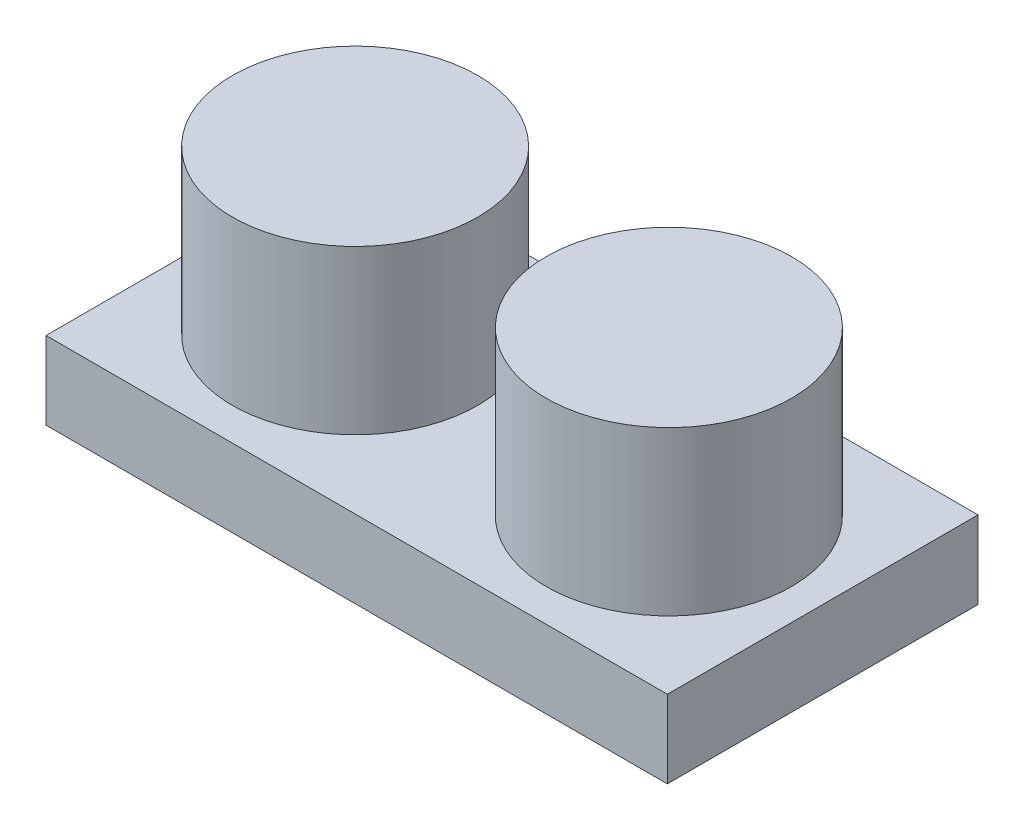
ISO-10303-21;
HEADER;
FILE_DESCRIPTION(('STEP AP214'),'2;1');
FILE_NAME('part.step','',(''),(''),'','','');
FILE_SCHEMA(('AUTOMOTIVE_DESIGN { 1 0 10303 214 1 1 1 1 }'));
ENDSEC;
DATA;
#1=APPLICATION_CONTEXT('core data for automotive mechanical design processes');
#2=APPLICATION_PROTOCOL_DEFINITION('international standard','automotive_design',2000,#1);
#3=PRODUCT_CONTEXT('',#1,'mechanical');
#4=PRODUCT('Part','Part','',(#3));
#5=PRODUCT_RELATED_PRODUCT_CATEGORY('part','',(#4));
#6=PRODUCT_DEFINITION_FORMATION('','',#4);
#7=PRODUCT_DEFINITION_CONTEXT('part definition',#1,'design');
#8=PRODUCT_DEFINITION('design','',#6,#7);
#9=PRODUCT_DEFINITION_SHAPE('','',#8);
#10=(LENGTH_UNIT() NAMED_UNIT(*) SI_UNIT(.MILLI.,.METRE.));
#11=(NAMED_UNIT(*) PLANE_ANGLE_UNIT() SI_UNIT($,.RADIAN.));
#12=(NAMED_UNIT(*) SI_UNIT($,.STERADIAN.) SOLID_ANGLE_UNIT());
#13=UNCERTAINTY_MEASURE_WITH_UNIT(LENGTH_MEASURE(1.E-05),#10,'distance_accuracy_value','');
#14=(GEOMETRIC_REPRESENTATION_CONTEXT(3) GLOBAL_UNCERTAINTY_ASSIGNED_CONTEXT((#13)) GLOBAL_UNIT_ASSIGNED_CONTEXT((#10,
#11,#12)) REPRESENTATION_CONTEXT('',''));
#15=CARTESIAN_POINT('',(0.,0.,0.));
#16=DIRECTION('',(0.,0.,1.));
#17=DIRECTION('',(1.,0.,0.));
#18=AXIS2_PLACEMENT_3D('',#15,#16,#17);
#19=CARTESIAN_POINT('',(20.,5.,-10.));
#20=DIRECTION('',(-1.,0.,0.));
#21=DIRECTION('',(0.,0.,1.));
#22=AXIS2_PLACEMENT_3D('',#19,#20,#21);
#23=PLANE('',#22);
#24=DIRECTION('',(0.,0.,-1.));
#25=VECTOR('',#24,1.);
#26=CARTESIAN_POINT('',(20.,0.,-10.));
#27=LINE('',#26,#25);
#28=CARTESIAN_POINT('',(20.,0.,10.));
#29=VERTEX_POINT('',#28);
#30=CARTESIAN_POINT('',(20.,0.,-10.));
#31=VERTEX_POINT('',#30);
#32=EDGE_CURVE('E111',#29,#31,#27,.T.);
#33=ORIENTED_EDGE('',*,*,#32,.T.);
#34=DIRECTION('',(0.,-1.,0.));
#35=VECTOR('',#34,1.);
#36=CARTESIAN_POINT('',(20.,5.,-10.));
#37=LINE('',#36,#35);
#38=CARTESIAN_POINT('',(20.,5.,-10.));
#39=VERTEX_POINT('',#38);
#40=EDGE_CURVE('E11',#39,#31,#37,.T.);
#41=ORIENTED_EDGE('',*,*,#40,.F.);
#42=DIRECTION('',(0.,0.,-1.));
#43=VECTOR('',#42,1.);
#44=CARTESIAN_POINT('',(20.,5.,-10.));
#45=LINE('',#44,#43);
#46=CARTESIAN_POINT('',(20.,5.,10.));
#47=VERTEX_POINT('',#46);
#48=EDGE_CURVE('E95',#47,#39,#45,.T.);
#49=ORIENTED_EDGE('',*,*,#48,.F.);
#50=DIRECTION('',(0.,-1.,0.));
#51=VECTOR('',#50,1.);
#52=CARTESIAN_POINT('',(20.,5.,10.));
#53=LINE('',#52,#51);
#54=EDGE_CURVE('E107',#47,#29,#53,.T.);
#55=ORIENTED_EDGE('',*,*,#54,.T.);
#56=EDGE_LOOP('',(#33,#41,#49,#55));
#57=FACE_BOUND('',#56,.T.);
#58=ADVANCED_FACE('F43',(#57),#23,.F.);
#59=CARTESIAN_POINT('',(-20.,5.,-10.));
#60=DIRECTION('',(0.,0.,1.));
#61=DIRECTION('',(1.,0.,0.));
#62=AXIS2_PLACEMENT_3D('',#59,#60,#61);
#63=PLANE('',#62);
#64=DIRECTION('',(-1.,0.,0.));
#65=VECTOR('',#64,1.);
#66=CARTESIAN_POINT('',(-20.,0.,-10.));
#67=LINE('',#66,#65);
#68=CARTESIAN_POINT('',(-20.,0.,-10.));
#69=VERTEX_POINT('',#68);
#70=EDGE_CURVE('E100',#31,#69,#67,.T.);
#71=ORIENTED_EDGE('',*,*,#70,.T.);
#72=DIRECTION('',(0.,-1.,0.));
#73=VECTOR('',#72,1.);
#74=CARTESIAN_POINT('',(-20.,5.,-10.));
#75=LINE('',#74,#73);
#76=CARTESIAN_POINT('',(-20.,5.,-10.));
#77=VERTEX_POINT('',#76);
#78=EDGE_CURVE('E52',#77,#69,#75,.T.);
#79=ORIENTED_EDGE('',*,*,#78,.F.);
#80=DIRECTION('',(-1.,0.,0.));
#81=VECTOR('',#80,1.);
#82=CARTESIAN_POINT('',(-20.,5.,-10.));
#83=LINE('',#82,#81);
#84=EDGE_CURVE('E90',#39,#77,#83,.T.);
#85=ORIENTED_EDGE('',*,*,#84,.F.);
#86=ORIENTED_EDGE('',*,*,#40,.T.);
#87=EDGE_LOOP('',(#71,#79,#85,#86));
#88=FACE_BOUND('',#87,.T.);
#89=ADVANCED_FACE('F99',(#88),#63,.F.);
#90=CARTESIAN_POINT('',(-20.,5.,-10.));
#91=DIRECTION('',(1.,0.,0.));
#92=DIRECTION('',(0.,0.,-1.));
#93=AXIS2_PLACEMENT_3D('',#90,#91,#92);
#94=PLANE('',#93);
#95=DIRECTION('',(0.,0.,1.));
#96=VECTOR('',#95,1.);
#97=CARTESIAN_POINT('',(-20.,0.,-10.));
#98=LINE('',#97,#96);
#99=CARTESIAN_POINT('',(-20.,0.,10.));
#100=VERTEX_POINT('',#99);
#101=EDGE_CURVE('E77',#69,#100,#98,.T.);
#102=ORIENTED_EDGE('',*,*,#101,.T.);
#103=DIRECTION('',(0.,-1.,0.));
#104=VECTOR('',#103,1.);
#105=CARTESIAN_POINT('',(-20.,5.,10.));
#106=LINE('',#105,#104);
#107=CARTESIAN_POINT('',(-20.,5.,10.));
#108=VERTEX_POINT('',#107);
#109=EDGE_CURVE('E102',#108,#100,#106,.T.);
#110=ORIENTED_EDGE('',*,*,#109,.F.);
#111=DIRECTION('',(0.,0.,1.));
#112=VECTOR('',#111,1.);
#113=CARTESIAN_POINT('',(-20.,5.,-10.));
#114=LINE('',#113,#112);
#115=EDGE_CURVE('E93',#77,#108,#114,.T.);
#116=ORIENTED_EDGE('',*,*,#115,.F.);
#117=ORIENTED_EDGE('',*,*,#78,.T.);
#118=EDGE_LOOP('',(#102,#110,#116,#117));
#119=FACE_BOUND('',#118,.T.);
#120=ADVANCED_FACE('F103',(#119),#94,.F.);
#121=CARTESIAN_POINT('',(-20.,5.,10.));
#122=DIRECTION('',(0.,0.,-1.));
#123=DIRECTION('',(-1.,0.,0.));
#124=AXIS2_PLACEMENT_3D('',#121,#122,#123);
#125=PLANE('',#124);
#126=DIRECTION('',(1.,0.,0.));
#127=VECTOR('',#126,1.);
#128=CARTESIAN_POINT('',(-20.,0.,10.));
#129=LINE('',#128,#127);
#130=EDGE_CURVE('E83',#100,#29,#129,.T.);
#131=ORIENTED_EDGE('',*,*,#130,.T.);
#132=ORIENTED_EDGE('',*,*,#54,.F.);
#133=DIRECTION('',(1.,0.,0.));
#134=VECTOR('',#133,1.);
#135=CARTESIAN_POINT('',(-20.,5.,10.));
#136=LINE('',#135,#134);
#137=EDGE_CURVE('E60',#108,#47,#136,.T.);
#138=ORIENTED_EDGE('',*,*,#137,.F.);
#139=ORIENTED_EDGE('',*,*,#109,.T.);
#140=EDGE_LOOP('',(#131,#132,#138,#139));
#141=FACE_BOUND('',#140,.T.);
#142=ADVANCED_FACE('F125',(#141),#125,.F.);
#143=CARTESIAN_POINT('',(0.,5.,0.));
#144=DIRECTION('',(0.,1.,0.));
#145=DIRECTION('',(0.,0.,1.));
#146=AXIS2_PLACEMENT_3D('',#143,#144,#145);
#147=PLANE('',#146);
#148=CARTESIAN_POINT('',(10.1,5.,0.));
#149=DIRECTION('',(0.,1.,0.));
#150=DIRECTION('',(0.,0.,1.));
#151=AXIS2_PLACEMENT_3D('',#148,#149,#150);
#152=CIRCLE('',#151,7.9);
#153=CARTESIAN_POINT('',(10.1,5.,-7.9));
#154=VERTEX_POINT('',#153);
#155=EDGE_CURVE('E136',#154,#154,#152,.T.);
#156=ORIENTED_EDGE('',*,*,#155,.F.);
#157=EDGE_LOOP('',(#156));
#158=FACE_BOUND('',#157,.T.);
#159=CARTESIAN_POINT('',(-10.1,5.,0.));
#160=DIRECTION('',(0.,1.,0.));
#161=DIRECTION('',(0.,0.,1.));
#162=AXIS2_PLACEMENT_3D('',#159,#160,#161);
#163=CIRCLE('',#162,7.9);
#164=CARTESIAN_POINT('',(-10.1,5.,-7.9));
#165=VERTEX_POINT('',#164);
#166=EDGE_CURVE('E132',#165,#165,#163,.T.);
#167=ORIENTED_EDGE('',*,*,#166,.F.);
#168=EDGE_LOOP('',(#167));
#169=FACE_BOUND('',#168,.T.);
#170=ORIENTED_EDGE('',*,*,#48,.T.);
#171=ORIENTED_EDGE('',*,*,#84,.T.);
#172=ORIENTED_EDGE('',*,*,#115,.T.);
#173=ORIENTED_EDGE('',*,*,#137,.T.);
#174=EDGE_LOOP('',(#170,#171,#172,#173));
#175=FACE_BOUND('',#174,.T.);
#176=ADVANCED_FACE('F91',(#158,#169,#175),#147,.T.);
#177=CARTESIAN_POINT('',(0.,0.,0.));
#178=DIRECTION('',(0.,1.,0.));
#179=DIRECTION('',(0.,0.,1.));
#180=AXIS2_PLACEMENT_3D('',#177,#178,#179);
#181=PLANE('',#180);
#182=ORIENTED_EDGE('',*,*,#32,.F.);
#183=ORIENTED_EDGE('',*,*,#130,.F.);
#184=ORIENTED_EDGE('',*,*,#101,.F.);
#185=ORIENTED_EDGE('',*,*,#70,.F.);
#186=EDGE_LOOP('',(#182,#183,#184,#185));
#187=FACE_BOUND('',#186,.T.);
#188=ADVANCED_FACE('F128',(#187),#181,.F.);
#189=CARTESIAN_POINT('',(-10.1,15.5,0.));
#190=DIRECTION('',(0.,-1.,0.));
#191=DIRECTION('',(0.,0.,-1.));
#192=AXIS2_PLACEMENT_3D('',#189,#190,#191);
#193=CYLINDRICAL_SURFACE('',#192,7.9);
#194=CARTESIAN_POINT('',(-10.1,15.5,0.));
#195=DIRECTION('',(0.,1.,0.));
#196=DIRECTION('',(0.,0.,1.));
#197=AXIS2_PLACEMENT_3D('',#194,#195,#196);
#198=CIRCLE('',#197,7.9);
#199=CARTESIAN_POINT('',(-10.1,15.5,-7.9));
#200=VERTEX_POINT('',#199);
#201=EDGE_CURVE('E115',#200,#200,#198,.T.);
#202=CARTESIAN_POINT('',(-10.1,15.5,-7.9));
#203=CARTESIAN_POINT('',(-10.1,15.390625,-7.9));
#204=CARTESIAN_POINT('',(-10.1,15.28125,-7.9));
#205=CARTESIAN_POINT('',(-10.1,15.0625,-7.9));
#206=CARTESIAN_POINT('',(-10.1,14.953125,-7.9));
#207=CARTESIAN_POINT('',(-10.1,14.734375,-7.9));
#208=CARTESIAN_POINT('',(-10.1,14.625,-7.9));
#209=CARTESIAN_POINT('',(-10.1,14.40625,-7.9));
#210=CARTESIAN_POINT('',(-10.1,14.296875,-7.9));
#211=CARTESIAN_POINT('',(-10.1,14.078125,-7.9));
#212=CARTESIAN_POINT('',(-10.1,13.96875,-7.9));
#213=CARTESIAN_POINT('',(-10.1,13.75,-7.9));
#214=CARTESIAN_POINT('',(-10.1,13.640625,-7.9));
#215=CARTESIAN_POINT('',(-10.1,13.421875,-7.9));
#216=CARTESIAN_POINT('',(-10.1,13.3125,-7.9));
#217=CARTESIAN_POINT('',(-10.1,13.09375,-7.9));
#218=CARTESIAN_POINT('',(-10.1,12.984375,-7.9));
#219=CARTESIAN_POINT('',(-10.1,12.765625,-7.9));
#220=CARTESIAN_POINT('',(-10.1,12.65625,-7.9));
#221=CARTESIAN_POINT('',(-10.1,12.4375,-7.9));
#222=CARTESIAN_POINT('',(-10.1,12.328125,-7.9));
#223=CARTESIAN_POINT('',(-10.1,12.109375,-7.9));
#224=CARTESIAN_POINT('',(-10.1,12.,-7.9));
#225=CARTESIAN_POINT('',(-10.1,11.78125,-7.9));
#226=CARTESIAN_POINT('',(-10.1,11.671875,-7.9));
#227=CARTESIAN_POINT('',(-10.1,11.453125,-7.9));
#228=CARTESIAN_POINT('',(-10.1,11.34375,-7.9));
#229=CARTESIAN_POINT('',(-10.1,11.125,-7.9));
#230=CARTESIAN_POINT('',(-10.1,11.015625,-7.9));
#231=CARTESIAN_POINT('',(-10.1,10.796875,-7.9));
#232=CARTESIAN_POINT('',(-10.1,10.6875,-7.9));
#233=CARTESIAN_POINT('',(-10.1,10.46875,-7.9));
#234=CARTESIAN_POINT('',(-10.1,10.359375,-7.9));
#235=CARTESIAN_POINT('',(-10.1,10.140625,-7.9));
#236=CARTESIAN_POINT('',(-10.1,10.03125,-7.9));
#237=CARTESIAN_POINT('',(-10.1,9.8125,-7.9));
#238=CARTESIAN_POINT('',(-10.1,9.703125,-7.9));
#239=CARTESIAN_POINT('',(-10.1,9.484375,-7.9));
#240=CARTESIAN_POINT('',(-10.1,9.375,-7.9));
#241=CARTESIAN_POINT('',(-10.1,9.15625,-7.9));
#242=CARTESIAN_POINT('',(-10.1,9.046875,-7.9));
#243=CARTESIAN_POINT('',(-10.1,8.828125,-7.9));
#244=CARTESIAN_POINT('',(-10.1,8.71875,-7.9));
#245=CARTESIAN_POINT('',(-10.1,8.5,-7.9));
#246=CARTESIAN_POINT('',(-10.1,8.390625,-7.9));
#247=CARTESIAN_POINT('',(-10.1,8.171875,-7.9));
#248=CARTESIAN_POINT('',(-10.1,8.0625,-7.9));
#249=CARTESIAN_POINT('',(-10.1,7.84375,-7.9));
#250=CARTESIAN_POINT('',(-10.1,7.734375,-7.9));
#251=CARTESIAN_POINT('',(-10.1,7.515625,-7.9));
#252=CARTESIAN_POINT('',(-10.1,7.40625,-7.9));
#253=CARTESIAN_POINT('',(-10.1,7.1875,-7.9));
#254=CARTESIAN_POINT('',(-10.1,7.078125,-7.9));
#255=CARTESIAN_POINT('',(-10.1,6.859375,-7.9));
#256=CARTESIAN_POINT('',(-10.1,6.75,-7.9));
#257=CARTESIAN_POINT('',(-10.1,6.53125,-7.9));
#258=CARTESIAN_POINT('',(-10.1,6.421875,-7.9));
#259=CARTESIAN_POINT('',(-10.1,6.203125,-7.9));
#260=CARTESIAN_POINT('',(-10.1,6.09375,-7.9));
#261=CARTESIAN_POINT('',(-10.1,5.875,-7.9));
#262=CARTESIAN_POINT('',(-10.1,5.765625,-7.9));
#263=CARTESIAN_POINT('',(-10.1,5.546875,-7.9));
#264=CARTESIAN_POINT('',(-10.1,5.4375,-7.9));
#265=CARTESIAN_POINT('',(-10.1,5.21875,-7.9));
#266=CARTESIAN_POINT('',(-10.1,5.109375,-7.9));
#267=CARTESIAN_POINT('',(-10.1,5.,-7.9));
#268=B_SPLINE_CURVE_WITH_KNOTS('',3,(#202,#203,#204,#205,#206,#207,#208,#209,#210,#211,#212,
#213,#214,#215,#216,#217,#218,#219,#220,#221,#222,#223,#224,#225,#226,#227,#228,#229,#230,#231,
#232,#233,#234,#235,#236,#237,#238,#239,#240,#241,#242,#243,#244,#245,#246,#247,#248,#249,#250,
#251,#252,#253,#254,#255,#256,#257,#258,#259,#260,#261,#262,#263,#264,#265,#266,#267),
.UNSPECIFIED.,.F.,.F.,(4,2,2,2,2,2,2,2,2,2,2,2,2,2,2,2,2,2,2,2,2,2,2,2,2,2,2,2,2,2,2,2,4),(0.,
0.328125,0.656250000000001,0.984375000000001,1.3125,1.640625,1.96875,2.296875,2.625,2.953125,
3.28125,3.609375,3.9375,4.265625,4.59375,4.921875,5.25,5.578125,5.90625,6.234375,6.5625,
6.890625,7.21875,7.546875,7.875,8.203125,8.53125,8.859375,9.1875,9.515625,9.84375,10.171875,
10.5),.UNSPECIFIED.);
#269=EDGE_CURVE('BSEAM155',#200,#165,#268,.T.);
#270=ORIENTED_EDGE('',*,*,#201,.F.);
#271=ORIENTED_EDGE('',*,*,#166,.T.);
#272=ORIENTED_EDGE('',*,*,#269,.T.);
#273=ORIENTED_EDGE('',*,*,#269,.F.);
#274=EDGE_LOOP('',(#270,#272,#271,#273));
#275=FACE_BOUND('',#274,.T.);
#276=ADVANCED_FACE('F155',(#275),#193,.T.);
#277=CARTESIAN_POINT('',(-10.1,15.5,0.));
#278=DIRECTION('',(0.,1.,0.));
#279=DIRECTION('',(0.,0.,1.));
#280=AXIS2_PLACEMENT_3D('',#277,#278,#279);
#281=PLANE('',#280);
#282=ORIENTED_EDGE('',*,*,#201,.T.);
#283=EDGE_LOOP('',(#282));
#284=FACE_BOUND('',#283,.T.);
#285=ADVANCED_FACE('F157',(#284),#281,.T.);
#286=CARTESIAN_POINT('',(10.1,15.5,0.));
#287=DIRECTION('',(0.,-1.,0.));
#288=DIRECTION('',(0.,0.,-1.));
#289=AXIS2_PLACEMENT_3D('',#286,#287,#288);
#290=CYLINDRICAL_SURFACE('',#289,7.9);
#291=CARTESIAN_POINT('',(10.1,15.5,0.));
#292=DIRECTION('',(0.,1.,0.));
#293=DIRECTION('',(0.,0.,1.));
#294=AXIS2_PLACEMENT_3D('',#291,#292,#293);
#295=CIRCLE('',#294,7.9);
#296=CARTESIAN_POINT('',(10.1,15.5,-7.9));
#297=VERTEX_POINT('',#296);
#298=EDGE_CURVE('E140',#297,#297,#295,.T.);
#299=CARTESIAN_POINT('',(10.1,15.5,-7.9));
#300=CARTESIAN_POINT('',(10.1,15.390625,-7.9));
#301=CARTESIAN_POINT('',(10.1,15.28125,-7.9));
#302=CARTESIAN_POINT('',(10.1,15.0625,-7.9));
#303=CARTESIAN_POINT('',(10.1,14.953125,-7.9));
#304=CARTESIAN_POINT('',(10.1,14.734375,-7.9));
#305=CARTESIAN_POINT('',(10.1,14.625,-7.9));
#306=CARTESIAN_POINT('',(10.1,14.40625,-7.9));
#307=CARTESIAN_POINT('',(10.1,14.296875,-7.9));
#308=CARTESIAN_POINT('',(10.1,14.078125,-7.9));
#309=CARTESIAN_POINT('',(10.1,13.96875,-7.9));
#310=CARTESIAN_POINT('',(10.1,13.75,-7.9));
#311=CARTESIAN_POINT('',(10.1,13.640625,-7.9));
#312=CARTESIAN_POINT('',(10.1,13.421875,-7.9));
#313=CARTESIAN_POINT('',(10.1,13.3125,-7.9));
#314=CARTESIAN_POINT('',(10.1,13.09375,-7.9));
#315=CARTESIAN_POINT('',(10.1,12.984375,-7.9));
#316=CARTESIAN_POINT('',(10.1,12.765625,-7.9));
#317=CARTESIAN_POINT('',(10.1,12.65625,-7.9));
#318=CARTESIAN_POINT('',(10.1,12.4375,-7.9));
#319=CARTESIAN_POINT('',(10.1,12.328125,-7.9));
#320=CARTESIAN_POINT('',(10.1,12.109375,-7.9));
#321=CARTESIAN_POINT('',(10.1,12.,-7.9));
#322=CARTESIAN_POINT('',(10.1,11.78125,-7.9));
#323=CARTESIAN_POINT('',(10.1,11.671875,-7.9));
#324=CARTESIAN_POINT('',(10.1,11.453125,-7.9));
#325=CARTESIAN_POINT('',(10.1,11.34375,-7.9));
#326=CARTESIAN_POINT('',(10.1,11.125,-7.9));
#327=CARTESIAN_POINT('',(10.1,11.015625,-7.9));
#328=CARTESIAN_POINT('',(10.1,10.796875,-7.9));
#329=CARTESIAN_POINT('',(10.1,10.6875,-7.9));
#330=CARTESIAN_POINT('',(10.1,10.46875,-7.9));
#331=CARTESIAN_POINT('',(10.1,10.359375,-7.9));
#332=CARTESIAN_POINT('',(10.1,10.140625,-7.9));
#333=CARTESIAN_POINT('',(10.1,10.03125,-7.9));
#334=CARTESIAN_POINT('',(10.1,9.8125,-7.9));
#335=CARTESIAN_POINT('',(10.1,9.703125,-7.9));
#336=CARTESIAN_POINT('',(10.1,9.484375,-7.9));
#337=CARTESIAN_POINT('',(10.1,9.375,-7.9));
#338=CARTESIAN_POINT('',(10.1,9.15625,-7.9));
#339=CARTESIAN_POINT('',(10.1,9.046875,-7.9));
#340=CARTESIAN_POINT('',(10.1,8.828125,-7.9));
#341=CARTESIAN_POINT('',(10.1,8.71875,-7.9));
#342=CARTESIAN_POINT('',(10.1,8.5,-7.9));
#343=CARTESIAN_POINT('',(10.1,8.390625,-7.9));
#344=CARTESIAN_POINT('',(10.1,8.171875,-7.9));
#345=CARTESIAN_POINT('',(10.1,8.0625,-7.9));
#346=CARTESIAN_POINT('',(10.1,7.84375,-7.9));
#347=CARTESIAN_POINT('',(10.1,7.734375,-7.9));
#348=CARTESIAN_POINT('',(10.1,7.515625,-7.9));
#349=CARTESIAN_POINT('',(10.1,7.40625,-7.9));
#350=CARTESIAN_POINT('',(10.1,7.1875,-7.9));
#351=CARTESIAN_POINT('',(10.1,7.078125,-7.9));
#352=CARTESIAN_POINT('',(10.1,6.859375,-7.9));
#353=CARTESIAN_POINT('',(10.1,6.75,-7.9));
#354=CARTESIAN_POINT('',(10.1,6.53125,-7.9));
#355=CARTESIAN_POINT('',(10.1,6.421875,-7.9));
#356=CARTESIAN_POINT('',(10.1,6.203125,-7.9));
#357=CARTESIAN_POINT('',(10.1,6.09375,-7.9));
#358=CARTESIAN_POINT('',(10.1,5.875,-7.9));
#359=CARTESIAN_POINT('',(10.1,5.765625,-7.9));
#360=CARTESIAN_POINT('',(10.1,5.546875,-7.9));
#361=CARTESIAN_POINT('',(10.1,5.4375,-7.9));
#362=CARTESIAN_POINT('',(10.1,5.21875,-7.9));
#363=CARTESIAN_POINT('',(10.1,5.109375,-7.9));
#364=CARTESIAN_POINT('',(10.1,5.,-7.9));
#365=B_SPLINE_CURVE_WITH_KNOTS('',3,(#299,#300,#301,#302,#303,#304,#305,#306,#307,#308,#309,
#310,#311,#312,#313,#314,#315,#316,#317,#318,#319,#320,#321,#322,#323,#324,#325,#326,#327,#328,
#329,#330,#331,#332,#333,#334,#335,#336,#337,#338,#339,#340,#341,#342,#343,#344,#345,#346,#347,
#348,#349,#350,#351,#352,#353,#354,#355,#356,#357,#358,#359,#360,#361,#362,#363,#364),
.UNSPECIFIED.,.F.,.F.,(4,2,2,2,2,2,2,2,2,2,2,2,2,2,2,2,2,2,2,2,2,2,2,2,2,2,2,2,2,2,2,2,4),(0.,
0.328125,0.656250000000001,0.984375000000001,1.3125,1.640625,1.96875,2.296875,2.625,2.953125,
3.28125,3.609375,3.9375,4.265625,4.59375,4.921875,5.25,5.578125,5.90625,6.234375,6.5625,
6.890625,7.21875,7.546875,7.875,8.203125,8.53125,8.859375,9.1875,9.515625,9.84375,10.171875,
10.5),.UNSPECIFIED.);
#366=EDGE_CURVE('BSEAM148',#297,#154,#365,.T.);
#367=ORIENTED_EDGE('',*,*,#298,.F.);
#368=ORIENTED_EDGE('',*,*,#155,.T.);
#369=ORIENTED_EDGE('',*,*,#366,.T.);
#370=ORIENTED_EDGE('',*,*,#366,.F.);
#371=EDGE_LOOP('',(#367,#369,#368,#370));
#372=FACE_BOUND('',#371,.T.);
#373=ADVANCED_FACE('F148',(#372),#290,.T.);
#374=CARTESIAN_POINT('',(10.1,15.5,0.));
#375=DIRECTION('',(0.,1.,0.));
#376=DIRECTION('',(0.,0.,1.));
#377=AXIS2_PLACEMENT_3D('',#374,#375,#376);
#378=PLANE('',#377);
#379=ORIENTED_EDGE('',*,*,#298,.T.);
#380=EDGE_LOOP('',(#379));
#381=FACE_BOUND('',#380,.T.);
#382=ADVANCED_FACE('F219',(#381),#378,.T.);
#383=CLOSED_SHELL('',(#58,#89,#120,#142,#176,#188,#276,#285,#373,#382));
#384=MANIFOLD_SOLID_BREP('B2',#383);
#385=ADVANCED_BREP_SHAPE_REPRESENTATION('',(#18,#384),#14);
#386=SHAPE_DEFINITION_REPRESENTATION(#9,#385);
ENDSEC;
END-ISO-10303-21;
